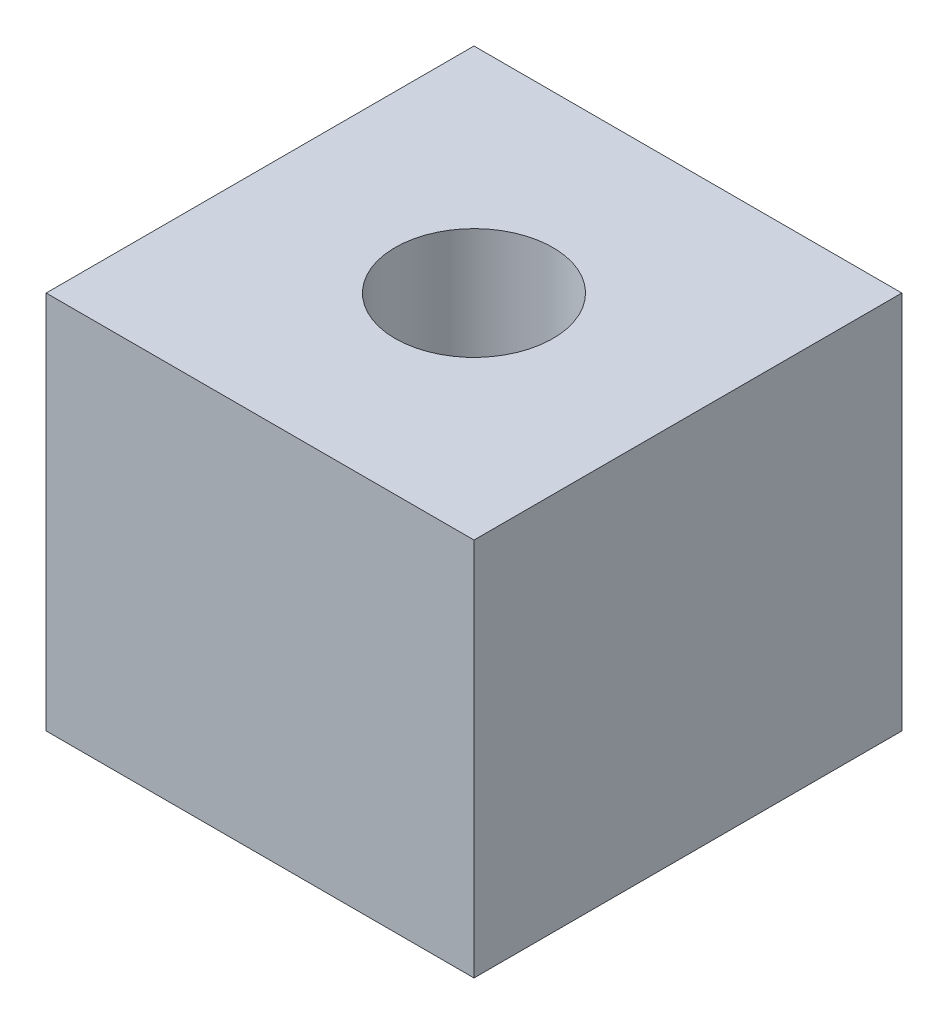
ISO-10303-21;
HEADER;
FILE_DESCRIPTION(('STEP AP214'),'2;1');
FILE_NAME('part.step','',(''),(''),'','','');
FILE_SCHEMA(('AUTOMOTIVE_DESIGN { 1 0 10303 214 1 1 1 1 }'));
ENDSEC;
DATA;
#1=APPLICATION_CONTEXT('core data for automotive mechanical design processes');
#2=APPLICATION_PROTOCOL_DEFINITION('international standard','automotive_design',2000,#1);
#3=PRODUCT_CONTEXT('',#1,'mechanical');
#4=PRODUCT('Part','Part','',(#3));
#5=PRODUCT_RELATED_PRODUCT_CATEGORY('part','',(#4));
#6=PRODUCT_DEFINITION_FORMATION('','',#4);
#7=PRODUCT_DEFINITION_CONTEXT('part definition',#1,'design');
#8=PRODUCT_DEFINITION('design','',#6,#7);
#9=PRODUCT_DEFINITION_SHAPE('','',#8);
#10=(LENGTH_UNIT() NAMED_UNIT(*) SI_UNIT(.MILLI.,.METRE.));
#11=(NAMED_UNIT(*) PLANE_ANGLE_UNIT() SI_UNIT($,.RADIAN.));
#12=(NAMED_UNIT(*) SI_UNIT($,.STERADIAN.) SOLID_ANGLE_UNIT());
#13=UNCERTAINTY_MEASURE_WITH_UNIT(LENGTH_MEASURE(1.E-05),#10,'distance_accuracy_value','');
#14=(GEOMETRIC_REPRESENTATION_CONTEXT(3) GLOBAL_UNCERTAINTY_ASSIGNED_CONTEXT((#13)) GLOBAL_UNIT_ASSIGNED_CONTEXT((#10,
#11,#12)) REPRESENTATION_CONTEXT('',''));
#15=CARTESIAN_POINT('',(0.,0.,0.));
#16=DIRECTION('',(0.,0.,1.));
#17=DIRECTION('',(1.,0.,0.));
#18=AXIS2_PLACEMENT_3D('',#15,#16,#17);
#19=CARTESIAN_POINT('',(0.,25.,-14.1));
#20=DIRECTION('',(0.,0.,-1.));
#21=DIRECTION('',(-1.,0.,0.));
#22=AXIS2_PLACEMENT_3D('',#19,#20,#21);
#23=PLANE('',#22);
#24=DIRECTION('',(1.,0.,0.));
#25=VECTOR('',#24,1.);
#26=CARTESIAN_POINT('',(0.,0.,-14.1));
#27=LINE('',#26,#25);
#28=CARTESIAN_POINT('',(-14.1,0.,-14.1));
#29=VERTEX_POINT('',#28);
#30=CARTESIAN_POINT('',(14.1,0.,-14.1));
#31=VERTEX_POINT('',#30);
#32=EDGE_CURVE('E112',#29,#31,#27,.T.);
#33=ORIENTED_EDGE('',*,*,#32,.F.);
#34=DIRECTION('',(0.,-1.,0.));
#35=VECTOR('',#34,1.);
#36=CARTESIAN_POINT('',(-14.1,25.,-14.1));
#37=LINE('',#36,#35);
#38=CARTESIAN_POINT('',(-14.1,25.,-14.1));
#39=VERTEX_POINT('',#38);
#40=EDGE_CURVE('E11',#39,#29,#37,.T.);
#41=ORIENTED_EDGE('',*,*,#40,.F.);
#42=DIRECTION('',(1.,0.,0.));
#43=VECTOR('',#42,1.);
#44=CARTESIAN_POINT('',(0.,25.,-14.1));
#45=LINE('',#44,#43);
#46=CARTESIAN_POINT('',(14.1,25.,-14.1));
#47=VERTEX_POINT('',#46);
#48=EDGE_CURVE('E93',#39,#47,#45,.T.);
#49=ORIENTED_EDGE('',*,*,#48,.T.);
#50=DIRECTION('',(0.,-1.,0.));
#51=VECTOR('',#50,1.);
#52=CARTESIAN_POINT('',(14.1,25.,-14.1));
#53=LINE('',#52,#51);
#54=EDGE_CURVE('E61',#47,#31,#53,.T.);
#55=ORIENTED_EDGE('',*,*,#54,.T.);
#56=EDGE_LOOP('',(#33,#41,#49,#55));
#57=FACE_BOUND('',#56,.T.);
#58=ADVANCED_FACE('F44',(#57),#23,.T.);
#59=CARTESIAN_POINT('',(-14.1,25.,0.));
#60=DIRECTION('',(1.,0.,0.));
#61=DIRECTION('',(0.,0.,-1.));
#62=AXIS2_PLACEMENT_3D('',#59,#60,#61);
#63=PLANE('',#62);
#64=CARTESIAN_POINT('',(-14.1,4.5,-7.5));
#65=DIRECTION('',(-1.,0.,0.));
#66=DIRECTION('',(0.,0.,1.));
#67=AXIS2_PLACEMENT_3D('',#64,#65,#66);
#68=CIRCLE('',#67,1.5);
#69=CARTESIAN_POINT('',(-14.1,4.5,-6.));
#70=VERTEX_POINT('',#69);
#71=EDGE_CURVE('E191',#70,#70,#68,.T.);
#72=ORIENTED_EDGE('',*,*,#71,.F.);
#73=EDGE_LOOP('',(#72));
#74=FACE_BOUND('',#73,.T.);
#75=CARTESIAN_POINT('',(-14.1,4.5,7.5));
#76=DIRECTION('',(-1.,0.,0.));
#77=DIRECTION('',(0.,0.,1.));
#78=AXIS2_PLACEMENT_3D('',#75,#76,#77);
#79=CIRCLE('',#78,1.5);
#80=CARTESIAN_POINT('',(-14.1,4.5,9.00000000000001));
#81=VERTEX_POINT('',#80);
#82=EDGE_CURVE('E199',#81,#81,#79,.T.);
#83=ORIENTED_EDGE('',*,*,#82,.F.);
#84=EDGE_LOOP('',(#83));
#85=FACE_BOUND('',#84,.T.);
#86=CARTESIAN_POINT('',(-14.1,20.5,7.5));
#87=DIRECTION('',(-1.,0.,0.));
#88=DIRECTION('',(0.,0.,1.));
#89=AXIS2_PLACEMENT_3D('',#86,#87,#88);
#90=CIRCLE('',#89,1.5);
#91=CARTESIAN_POINT('',(-14.1,20.5,9.00000000000001));
#92=VERTEX_POINT('',#91);
#93=EDGE_CURVE('E183',#92,#92,#90,.T.);
#94=ORIENTED_EDGE('',*,*,#93,.F.);
#95=EDGE_LOOP('',(#94));
#96=FACE_BOUND('',#95,.T.);
#97=CARTESIAN_POINT('',(-14.1,20.5,-7.5));
#98=DIRECTION('',(-1.,0.,0.));
#99=DIRECTION('',(0.,0.,1.));
#100=AXIS2_PLACEMENT_3D('',#97,#98,#99);
#101=CIRCLE('',#100,1.5);
#102=CARTESIAN_POINT('',(-14.1,20.5,-6.));
#103=VERTEX_POINT('',#102);
#104=EDGE_CURVE('E179',#103,#103,#101,.T.);
#105=ORIENTED_EDGE('',*,*,#104,.F.);
#106=EDGE_LOOP('',(#105));
#107=FACE_BOUND('',#106,.T.);
#108=DIRECTION('',(0.,0.,1.));
#109=VECTOR('',#108,1.);
#110=CARTESIAN_POINT('',(-14.1,0.,0.));
#111=LINE('',#110,#109);
#112=CARTESIAN_POINT('',(-14.1,0.,14.1));
#113=VERTEX_POINT('',#112);
#114=EDGE_CURVE('E100',#29,#113,#111,.T.);
#115=ORIENTED_EDGE('',*,*,#114,.T.);
#116=DIRECTION('',(0.,-1.,0.));
#117=VECTOR('',#116,1.);
#118=CARTESIAN_POINT('',(-14.1,25.,14.1));
#119=LINE('',#118,#117);
#120=CARTESIAN_POINT('',(-14.1,25.,14.1));
#121=VERTEX_POINT('',#120);
#122=EDGE_CURVE('E53',#121,#113,#119,.T.);
#123=ORIENTED_EDGE('',*,*,#122,.F.);
#124=DIRECTION('',(0.,0.,1.));
#125=VECTOR('',#124,1.);
#126=CARTESIAN_POINT('',(-14.1,25.,0.));
#127=LINE('',#126,#125);
#128=EDGE_CURVE('E87',#39,#121,#127,.T.);
#129=ORIENTED_EDGE('',*,*,#128,.F.);
#130=ORIENTED_EDGE('',*,*,#40,.T.);
#131=EDGE_LOOP('',(#115,#123,#129,#130));
#132=FACE_BOUND('',#131,.T.);
#133=ADVANCED_FACE('F98',(#74,#85,#96,#107,#132),#63,.F.);
#134=CARTESIAN_POINT('',(0.,25.,14.1));
#135=DIRECTION('',(0.,0.,-1.));
#136=DIRECTION('',(-1.,0.,0.));
#137=AXIS2_PLACEMENT_3D('',#134,#135,#136);
#138=PLANE('',#137);
#139=DIRECTION('',(1.,0.,0.));
#140=VECTOR('',#139,1.);
#141=CARTESIAN_POINT('',(0.,0.,14.1));
#142=LINE('',#141,#140);
#143=CARTESIAN_POINT('',(14.1,0.,14.1));
#144=VERTEX_POINT('',#143);
#145=EDGE_CURVE('E118',#113,#144,#142,.T.);
#146=ORIENTED_EDGE('',*,*,#145,.T.);
#147=DIRECTION('',(0.,-1.,0.));
#148=VECTOR('',#147,1.);
#149=CARTESIAN_POINT('',(14.1,25.,14.1));
#150=LINE('',#149,#148);
#151=CARTESIAN_POINT('',(14.1,25.,14.1));
#152=VERTEX_POINT('',#151);
#153=EDGE_CURVE('E75',#152,#144,#150,.T.);
#154=ORIENTED_EDGE('',*,*,#153,.F.);
#155=DIRECTION('',(1.,0.,0.));
#156=VECTOR('',#155,1.);
#157=CARTESIAN_POINT('',(0.,25.,14.1));
#158=LINE('',#157,#156);
#159=EDGE_CURVE('E92',#121,#152,#158,.T.);
#160=ORIENTED_EDGE('',*,*,#159,.F.);
#161=ORIENTED_EDGE('',*,*,#122,.T.);
#162=EDGE_LOOP('',(#146,#154,#160,#161));
#163=FACE_BOUND('',#162,.T.);
#164=ADVANCED_FACE('F104',(#163),#138,.F.);
#165=CARTESIAN_POINT('',(14.1,25.,0.));
#166=DIRECTION('',(1.,0.,0.));
#167=DIRECTION('',(0.,0.,-1.));
#168=AXIS2_PLACEMENT_3D('',#165,#166,#167);
#169=PLANE('',#168);
#170=DIRECTION('',(0.,0.,1.));
#171=VECTOR('',#170,1.);
#172=CARTESIAN_POINT('',(14.1,0.,0.));
#173=LINE('',#172,#171);
#174=EDGE_CURVE('E121',#31,#144,#173,.T.);
#175=ORIENTED_EDGE('',*,*,#174,.F.);
#176=ORIENTED_EDGE('',*,*,#54,.F.);
#177=DIRECTION('',(0.,0.,1.));
#178=VECTOR('',#177,1.);
#179=CARTESIAN_POINT('',(14.1,25.,0.));
#180=LINE('',#179,#178);
#181=EDGE_CURVE('E106',#47,#152,#180,.T.);
#182=ORIENTED_EDGE('',*,*,#181,.T.);
#183=ORIENTED_EDGE('',*,*,#153,.T.);
#184=EDGE_LOOP('',(#175,#176,#182,#183));
#185=FACE_BOUND('',#184,.T.);
#186=ADVANCED_FACE('F239',(#185),#169,.T.);
#187=CARTESIAN_POINT('',(0.,25.,0.));
#188=DIRECTION('',(0.,1.,0.));
#189=DIRECTION('',(0.,0.,1.));
#190=AXIS2_PLACEMENT_3D('',#187,#188,#189);
#191=PLANE('',#190);
#192=CARTESIAN_POINT('',(0.,25.,0.));
#193=DIRECTION('',(0.,1.,0.));
#194=DIRECTION('',(0.,0.,1.));
#195=AXIS2_PLACEMENT_3D('',#192,#193,#194);
#196=CIRCLE('',#195,5.2);
#197=CARTESIAN_POINT('',(0.,25.,5.2));
#198=VERTEX_POINT('',#197);
#199=EDGE_CURVE('E115',#198,#198,#196,.T.);
#200=ORIENTED_EDGE('',*,*,#199,.F.);
#201=EDGE_LOOP('',(#200));
#202=FACE_BOUND('',#201,.T.);
#203=ORIENTED_EDGE('',*,*,#48,.F.);
#204=ORIENTED_EDGE('',*,*,#128,.T.);
#205=ORIENTED_EDGE('',*,*,#159,.T.);
#206=ORIENTED_EDGE('',*,*,#181,.F.);
#207=EDGE_LOOP('',(#203,#204,#205,#206));
#208=FACE_BOUND('',#207,.T.);
#209=ADVANCED_FACE('F89',(#202,#208),#191,.T.);
#210=CARTESIAN_POINT('',(0.,0.,0.));
#211=DIRECTION('',(0.,1.,0.));
#212=DIRECTION('',(0.,0.,1.));
#213=AXIS2_PLACEMENT_3D('',#210,#211,#212);
#214=PLANE('',#213);
#215=CARTESIAN_POINT('',(0.,0.,0.));
#216=DIRECTION('',(0.,1.,0.));
#217=DIRECTION('',(0.,0.,1.));
#218=AXIS2_PLACEMENT_3D('',#215,#216,#217);
#219=CIRCLE('',#218,11.1);
#220=CARTESIAN_POINT('',(0.,0.,11.1));
#221=VERTEX_POINT('',#220);
#222=EDGE_CURVE('E151',#221,#221,#219,.T.);
#223=ORIENTED_EDGE('',*,*,#222,.T.);
#224=EDGE_LOOP('',(#223));
#225=FACE_BOUND('',#224,.T.);
#226=ORIENTED_EDGE('',*,*,#32,.T.);
#227=ORIENTED_EDGE('',*,*,#174,.T.);
#228=ORIENTED_EDGE('',*,*,#145,.F.);
#229=ORIENTED_EDGE('',*,*,#114,.F.);
#230=EDGE_LOOP('',(#226,#227,#228,#229));
#231=FACE_BOUND('',#230,.T.);
#232=ADVANCED_FACE('F238',(#225,#231),#214,.F.);
#233=CARTESIAN_POINT('',(0.,25.,0.));
#234=DIRECTION('',(0.,-1.,0.));
#235=DIRECTION('',(0.,0.,-1.));
#236=AXIS2_PLACEMENT_3D('',#233,#234,#235);
#237=CYLINDRICAL_SURFACE('',#236,5.2);
#238=CARTESIAN_POINT('',(0.,3.5,0.));
#239=DIRECTION('',(0.,1.,0.));
#240=DIRECTION('',(0.,0.,1.));
#241=AXIS2_PLACEMENT_3D('',#238,#239,#240);
#242=CIRCLE('',#241,5.2);
#243=CARTESIAN_POINT('',(0.,3.5,5.2));
#244=VERTEX_POINT('',#243);
#245=EDGE_CURVE('E160',#244,#244,#242,.T.);
#246=ORIENTED_EDGE('',*,*,#245,.F.);
#247=EDGE_LOOP('',(#246));
#248=FACE_BOUND('',#247,.T.);
#249=ORIENTED_EDGE('',*,*,#199,.T.);
#250=EDGE_LOOP('',(#249));
#251=FACE_BOUND('',#250,.T.);
#252=ADVANCED_FACE('F251',(#248,#251),#237,.F.);
#253=CARTESIAN_POINT('',(0.,3.5,0.));
#254=DIRECTION('',(0.,-1.,0.));
#255=DIRECTION('',(0.,0.,-1.));
#256=AXIS2_PLACEMENT_3D('',#253,#254,#255);
#257=CYLINDRICAL_SURFACE('',#256,11.1);
#258=CARTESIAN_POINT('',(0.,3.5,0.));
#259=DIRECTION('',(0.,1.,0.));
#260=DIRECTION('',(0.,0.,1.));
#261=AXIS2_PLACEMENT_3D('',#258,#259,#260);
#262=CIRCLE('',#261,11.1);
#263=CARTESIAN_POINT('',(0.,3.5,11.1));
#264=VERTEX_POINT('',#263);
#265=EDGE_CURVE('E140',#264,#264,#262,.T.);
#266=ORIENTED_EDGE('',*,*,#265,.T.);
#267=EDGE_LOOP('',(#266));
#268=FACE_BOUND('',#267,.T.);
#269=ORIENTED_EDGE('',*,*,#222,.F.);
#270=EDGE_LOOP('',(#269));
#271=FACE_BOUND('',#270,.T.);
#272=ADVANCED_FACE('F256',(#268,#271),#257,.F.);
#273=CARTESIAN_POINT('',(0.,3.5,0.));
#274=DIRECTION('',(0.,1.,0.));
#275=DIRECTION('',(0.,0.,1.));
#276=AXIS2_PLACEMENT_3D('',#273,#274,#275);
#277=PLANE('',#276);
#278=CARTESIAN_POINT('',(7.99999999999977,3.5,2.27373675443232E-13));
#279=DIRECTION('',(0.,1.,0.));
#280=DIRECTION('',(0.,0.,1.));
#281=AXIS2_PLACEMENT_3D('',#278,#279,#280);
#282=CIRCLE('',#281,1.5);
#283=CARTESIAN_POINT('',(7.99999999999977,3.5,1.50000000000023));
#284=VERTEX_POINT('',#283);
#285=EDGE_CURVE('E155',#284,#284,#282,.T.);
#286=ORIENTED_EDGE('',*,*,#285,.T.);
#287=EDGE_LOOP('',(#286));
#288=FACE_BOUND('',#287,.T.);
#289=CARTESIAN_POINT('',(-4.52762827229947E-13,3.5,8.));
#290=DIRECTION('',(0.,1.,0.));
#291=DIRECTION('',(0.,0.,1.));
#292=AXIS2_PLACEMENT_3D('',#289,#290,#291);
#293=CIRCLE('',#292,1.5);
#294=CARTESIAN_POINT('',(-4.52762827229947E-13,3.5,9.5));
#295=VERTEX_POINT('',#294);
#296=EDGE_CURVE('E172',#295,#295,#293,.T.);
#297=ORIENTED_EDGE('',*,*,#296,.T.);
#298=EDGE_LOOP('',(#297));
#299=FACE_BOUND('',#298,.T.);
#300=CARTESIAN_POINT('',(-8.00000000000023,3.5,-2.26393958003914E-13));
#301=DIRECTION('',(0.,1.,0.));
#302=DIRECTION('',(0.,0.,1.));
#303=AXIS2_PLACEMENT_3D('',#300,#301,#302);
#304=CIRCLE('',#303,1.5);
#305=CARTESIAN_POINT('',(-8.00000000000023,3.5,1.49999999999977));
#306=VERTEX_POINT('',#305);
#307=EDGE_CURVE('E168',#306,#306,#304,.T.);
#308=ORIENTED_EDGE('',*,*,#307,.T.);
#309=EDGE_LOOP('',(#308));
#310=FACE_BOUND('',#309,.T.);
#311=CARTESIAN_POINT('',(0.,3.5,-8.));
#312=DIRECTION('',(0.,1.,0.));
#313=DIRECTION('',(0.,0.,1.));
#314=AXIS2_PLACEMENT_3D('',#311,#312,#313);
#315=CIRCLE('',#314,1.5);
#316=CARTESIAN_POINT('',(0.,3.5,-6.5));
#317=VERTEX_POINT('',#316);
#318=EDGE_CURVE('E164',#317,#317,#315,.T.);
#319=ORIENTED_EDGE('',*,*,#318,.T.);
#320=EDGE_LOOP('',(#319));
#321=FACE_BOUND('',#320,.T.);
#322=ORIENTED_EDGE('',*,*,#245,.T.);
#323=EDGE_LOOP('',(#322));
#324=FACE_BOUND('',#323,.T.);
#325=ORIENTED_EDGE('',*,*,#265,.F.);
#326=EDGE_LOOP('',(#325));
#327=FACE_BOUND('',#326,.T.);
#328=ADVANCED_FACE('F280',(#288,#299,#310,#321,#324,#327),#277,.F.);
#329=CARTESIAN_POINT('',(0.,8.,0.));
#330=DIRECTION('',(0.,1.,0.));
#331=DIRECTION('',(0.,0.,1.));
#332=AXIS2_PLACEMENT_3D('',#329,#330,#331);
#333=PLANE('',#332);
#334=CARTESIAN_POINT('',(-4.52762827229947E-13,8.,8.));
#335=DIRECTION('',(0.,1.,0.));
#336=DIRECTION('',(0.,0.,1.));
#337=AXIS2_PLACEMENT_3D('',#334,#335,#336);
#338=CIRCLE('',#337,1.5);
#339=CARTESIAN_POINT('',(-4.52762827229947E-13,8.,9.5));
#340=VERTEX_POINT('',#339);
#341=EDGE_CURVE('E144',#340,#340,#338,.T.);
#342=ORIENTED_EDGE('',*,*,#341,.F.);
#343=EDGE_LOOP('',(#342));
#344=FACE_BOUND('',#343,.T.);
#345=ADVANCED_FACE('F277',(#344),#333,.F.);
#346=CARTESIAN_POINT('',(-4.52762827229947E-13,8.,8.));
#347=DIRECTION('',(0.,-1.,0.));
#348=DIRECTION('',(0.,0.,-1.));
#349=AXIS2_PLACEMENT_3D('',#346,#347,#348);
#350=CYLINDRICAL_SURFACE('',#349,1.5);
#351=ORIENTED_EDGE('',*,*,#296,.F.);
#352=EDGE_LOOP('',(#351));
#353=FACE_BOUND('',#352,.T.);
#354=ORIENTED_EDGE('',*,*,#341,.T.);
#355=EDGE_LOOP('',(#354));
#356=FACE_BOUND('',#355,.T.);
#357=ADVANCED_FACE('F273',(#353,#356),#350,.F.);
#358=CARTESIAN_POINT('',(0.,8.,0.));
#359=DIRECTION('',(0.,1.,0.));
#360=DIRECTION('',(0.,0.,1.));
#361=AXIS2_PLACEMENT_3D('',#358,#359,#360);
#362=PLANE('',#361);
#363=CARTESIAN_POINT('',(7.99999999999977,8.,2.27373675443232E-13));
#364=DIRECTION('',(0.,1.,0.));
#365=DIRECTION('',(0.,0.,1.));
#366=AXIS2_PLACEMENT_3D('',#363,#364,#365);
#367=CIRCLE('',#366,1.5);
#368=CARTESIAN_POINT('',(7.99999999999977,8.,1.50000000000023));
#369=VERTEX_POINT('',#368);
#370=EDGE_CURVE('E139',#369,#369,#367,.T.);
#371=ORIENTED_EDGE('',*,*,#370,.F.);
#372=EDGE_LOOP('',(#371));
#373=FACE_BOUND('',#372,.T.);
#374=ADVANCED_FACE('F269',(#373),#362,.F.);
#375=CARTESIAN_POINT('',(7.99999999999977,8.,2.27373675443232E-13));
#376=DIRECTION('',(0.,-1.,0.));
#377=DIRECTION('',(0.,0.,-1.));
#378=AXIS2_PLACEMENT_3D('',#375,#376,#377);
#379=CYLINDRICAL_SURFACE('',#378,1.5);
#380=ORIENTED_EDGE('',*,*,#285,.F.);
#381=EDGE_LOOP('',(#380));
#382=FACE_BOUND('',#381,.T.);
#383=ORIENTED_EDGE('',*,*,#370,.T.);
#384=EDGE_LOOP('',(#383));
#385=FACE_BOUND('',#384,.T.);
#386=ADVANCED_FACE('F265',(#382,#385),#379,.F.);
#387=CARTESIAN_POINT('',(0.,8.,0.));
#388=DIRECTION('',(0.,1.,0.));
#389=DIRECTION('',(0.,0.,1.));
#390=AXIS2_PLACEMENT_3D('',#387,#388,#389);
#391=PLANE('',#390);
#392=CARTESIAN_POINT('',(0.,8.,-8.));
#393=DIRECTION('',(0.,1.,0.));
#394=DIRECTION('',(0.,0.,1.));
#395=AXIS2_PLACEMENT_3D('',#392,#393,#394);
#396=CIRCLE('',#395,1.5);
#397=CARTESIAN_POINT('',(0.,8.,-6.5));
#398=VERTEX_POINT('',#397);
#399=EDGE_CURVE('E135',#398,#398,#396,.T.);
#400=ORIENTED_EDGE('',*,*,#399,.F.);
#401=EDGE_LOOP('',(#400));
#402=FACE_BOUND('',#401,.T.);
#403=ADVANCED_FACE('F261',(#402),#391,.F.);
#404=CARTESIAN_POINT('',(0.,8.,-8.));
#405=DIRECTION('',(0.,-1.,0.));
#406=DIRECTION('',(0.,0.,-1.));
#407=AXIS2_PLACEMENT_3D('',#404,#405,#406);
#408=CYLINDRICAL_SURFACE('',#407,1.5);
#409=ORIENTED_EDGE('',*,*,#318,.F.);
#410=EDGE_LOOP('',(#409));
#411=FACE_BOUND('',#410,.T.);
#412=ORIENTED_EDGE('',*,*,#399,.T.);
#413=EDGE_LOOP('',(#412));
#414=FACE_BOUND('',#413,.T.);
#415=ADVANCED_FACE('F258',(#411,#414),#408,.F.);
#416=CARTESIAN_POINT('',(0.,8.,0.));
#417=DIRECTION('',(0.,1.,0.));
#418=DIRECTION('',(0.,0.,1.));
#419=AXIS2_PLACEMENT_3D('',#416,#417,#418);
#420=PLANE('',#419);
#421=CARTESIAN_POINT('',(-8.00000000000023,8.,-2.26393958003914E-13));
#422=DIRECTION('',(0.,1.,0.));
#423=DIRECTION('',(0.,0.,1.));
#424=AXIS2_PLACEMENT_3D('',#421,#422,#423);
#425=CIRCLE('',#424,1.5);
#426=CARTESIAN_POINT('',(-8.00000000000023,8.,1.49999999999977));
#427=VERTEX_POINT('',#426);
#428=EDGE_CURVE('E134',#427,#427,#425,.T.);
#429=ORIENTED_EDGE('',*,*,#428,.F.);
#430=EDGE_LOOP('',(#429));
#431=FACE_BOUND('',#430,.T.);
#432=ADVANCED_FACE('F230',(#431),#420,.F.);
#433=CARTESIAN_POINT('',(-8.00000000000023,8.,-2.26393958003914E-13));
#434=DIRECTION('',(0.,-1.,0.));
#435=DIRECTION('',(0.,0.,-1.));
#436=AXIS2_PLACEMENT_3D('',#433,#434,#435);
#437=CYLINDRICAL_SURFACE('',#436,1.5);
#438=ORIENTED_EDGE('',*,*,#307,.F.);
#439=EDGE_LOOP('',(#438));
#440=FACE_BOUND('',#439,.T.);
#441=ORIENTED_EDGE('',*,*,#428,.T.);
#442=EDGE_LOOP('',(#441));
#443=FACE_BOUND('',#442,.T.);
#444=ADVANCED_FACE('F221',(#440,#443),#437,.F.);
#445=CARTESIAN_POINT('',(-9.1,20.5,-7.5));
#446=DIRECTION('',(-1.,0.,0.));
#447=DIRECTION('',(0.,0.,1.));
#448=AXIS2_PLACEMENT_3D('',#445,#446,#447);
#449=CYLINDRICAL_SURFACE('',#448,1.5);
#450=CARTESIAN_POINT('',(-9.1,20.5,-7.5));
#451=DIRECTION('',(-1.,0.,0.));
#452=DIRECTION('',(0.,0.,1.));
#453=AXIS2_PLACEMENT_3D('',#450,#451,#452);
#454=CIRCLE('',#453,1.5);
#455=CARTESIAN_POINT('',(-9.1,20.5,-6.));
#456=VERTEX_POINT('',#455);
#457=EDGE_CURVE('E156',#456,#456,#454,.T.);
#458=ORIENTED_EDGE('',*,*,#457,.F.);
#459=EDGE_LOOP('',(#458));
#460=FACE_BOUND('',#459,.T.);
#461=ORIENTED_EDGE('',*,*,#104,.T.);
#462=EDGE_LOOP('',(#461));
#463=FACE_BOUND('',#462,.T.);
#464=ADVANCED_FACE('F218',(#460,#463),#449,.F.);
#465=CARTESIAN_POINT('',(-9.1,20.5,-7.5));
#466=DIRECTION('',(-1.,0.,0.));
#467=DIRECTION('',(0.,0.,1.));
#468=AXIS2_PLACEMENT_3D('',#465,#466,#467);
#469=PLANE('',#468);
#470=ORIENTED_EDGE('',*,*,#457,.T.);
#471=EDGE_LOOP('',(#470));
#472=FACE_BOUND('',#471,.T.);
#473=ADVANCED_FACE('F220',(#472),#469,.T.);
#474=CARTESIAN_POINT('',(-9.1,20.5,7.5));
#475=DIRECTION('',(-1.,0.,0.));
#476=DIRECTION('',(0.,0.,1.));
#477=AXIS2_PLACEMENT_3D('',#474,#475,#476);
#478=CYLINDRICAL_SURFACE('',#477,1.5);
#479=CARTESIAN_POINT('',(-9.1,20.5,7.5));
#480=DIRECTION('',(-1.,0.,0.));
#481=DIRECTION('',(0.,0.,1.));
#482=AXIS2_PLACEMENT_3D('',#479,#480,#481);
#483=CIRCLE('',#482,1.5);
#484=CARTESIAN_POINT('',(-9.1,20.5,9.00000000000001));
#485=VERTEX_POINT('',#484);
#486=EDGE_CURVE('E203',#485,#485,#483,.T.);
#487=ORIENTED_EDGE('',*,*,#486,.F.);
#488=EDGE_LOOP('',(#487));
#489=FACE_BOUND('',#488,.T.);
#490=ORIENTED_EDGE('',*,*,#93,.T.);
#491=EDGE_LOOP('',(#490));
#492=FACE_BOUND('',#491,.T.);
#493=ADVANCED_FACE('F211',(#489,#492),#478,.F.);
#494=CARTESIAN_POINT('',(-9.1,20.5,7.5));
#495=DIRECTION('',(-1.,0.,0.));
#496=DIRECTION('',(0.,0.,1.));
#497=AXIS2_PLACEMENT_3D('',#494,#495,#496);
#498=PLANE('',#497);
#499=ORIENTED_EDGE('',*,*,#486,.T.);
#500=EDGE_LOOP('',(#499));
#501=FACE_BOUND('',#500,.T.);
#502=ADVANCED_FACE('F382',(#501),#498,.T.);
#503=CARTESIAN_POINT('',(-9.1,4.5,7.5));
#504=DIRECTION('',(-1.,0.,0.));
#505=DIRECTION('',(0.,0.,1.));
#506=AXIS2_PLACEMENT_3D('',#503,#504,#505);
#507=CYLINDRICAL_SURFACE('',#506,1.5);
#508=CARTESIAN_POINT('',(-9.1,4.5,7.5));
#509=DIRECTION('',(-1.,0.,0.));
#510=DIRECTION('',(0.,0.,1.));
#511=AXIS2_PLACEMENT_3D('',#508,#509,#510);
#512=CIRCLE('',#511,1.5);
#513=CARTESIAN_POINT('',(-9.1,4.5,9.00000000000001));
#514=VERTEX_POINT('',#513);
#515=EDGE_CURVE('E195',#514,#514,#512,.T.);
#516=ORIENTED_EDGE('',*,*,#515,.F.);
#517=EDGE_LOOP('',(#516));
#518=FACE_BOUND('',#517,.T.);
#519=ORIENTED_EDGE('',*,*,#82,.T.);
#520=EDGE_LOOP('',(#519));
#521=FACE_BOUND('',#520,.T.);
#522=ADVANCED_FACE('F393',(#518,#521),#507,.F.);
#523=CARTESIAN_POINT('',(-9.1,4.5,7.5));
#524=DIRECTION('',(-1.,0.,0.));
#525=DIRECTION('',(0.,0.,1.));
#526=AXIS2_PLACEMENT_3D('',#523,#524,#525);
#527=PLANE('',#526);
#528=ORIENTED_EDGE('',*,*,#515,.T.);
#529=EDGE_LOOP('',(#528));
#530=FACE_BOUND('',#529,.T.);
#531=ADVANCED_FACE('F404',(#530),#527,.T.);
#532=CARTESIAN_POINT('',(-9.1,4.5,-7.5));
#533=DIRECTION('',(-1.,0.,0.));
#534=DIRECTION('',(0.,0.,1.));
#535=AXIS2_PLACEMENT_3D('',#532,#533,#534);
#536=CYLINDRICAL_SURFACE('',#535,1.5);
#537=CARTESIAN_POINT('',(-9.1,4.5,-7.5));
#538=DIRECTION('',(-1.,0.,0.));
#539=DIRECTION('',(0.,0.,1.));
#540=AXIS2_PLACEMENT_3D('',#537,#538,#539);
#541=CIRCLE('',#540,1.5);
#542=CARTESIAN_POINT('',(-9.1,4.5,-6.));
#543=VERTEX_POINT('',#542);
#544=EDGE_CURVE('E187',#543,#543,#541,.T.);
#545=ORIENTED_EDGE('',*,*,#544,.F.);
#546=EDGE_LOOP('',(#545));
#547=FACE_BOUND('',#546,.T.);
#548=ORIENTED_EDGE('',*,*,#71,.T.);
#549=EDGE_LOOP('',(#548));
#550=FACE_BOUND('',#549,.T.);
#551=ADVANCED_FACE('F415',(#547,#550),#536,.F.);
#552=CARTESIAN_POINT('',(-9.1,4.5,-7.5));
#553=DIRECTION('',(-1.,0.,0.));
#554=DIRECTION('',(0.,0.,1.));
#555=AXIS2_PLACEMENT_3D('',#552,#553,#554);
#556=PLANE('',#555);
#557=ORIENTED_EDGE('',*,*,#544,.T.);
#558=EDGE_LOOP('',(#557));
#559=FACE_BOUND('',#558,.T.);
#560=ADVANCED_FACE('F426',(#559),#556,.T.);
#561=CLOSED_SHELL('',(#58,#133,#164,#186,#209,#232,#252,#272,#328,#345,#357,#374,#386,#403,#415,
#432,#444,#464,#473,#493,#502,#522,#531,#551,#560));
#562=MANIFOLD_SOLID_BREP('B2',#561);
#563=ADVANCED_BREP_SHAPE_REPRESENTATION('',(#18,#562),#14);
#564=SHAPE_DEFINITION_REPRESENTATION(#9,#563);
ENDSEC;
END-ISO-10303-21;
